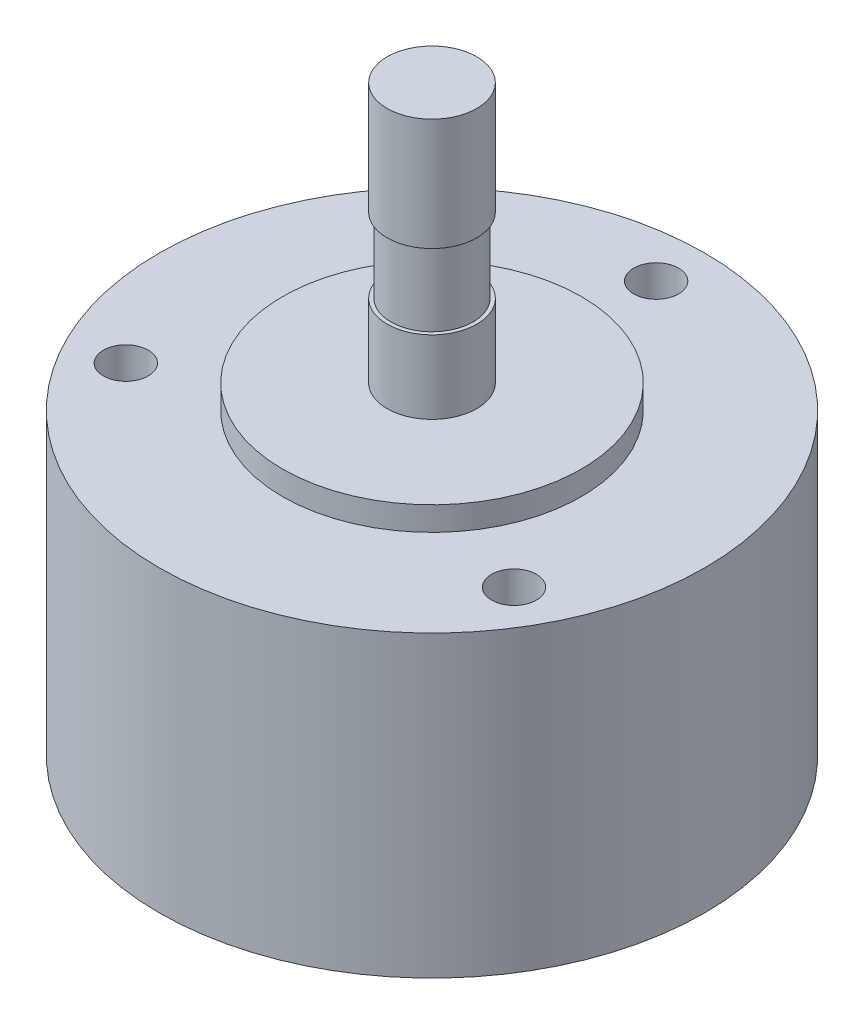
ISO-10303-21;
HEADER;
FILE_DESCRIPTION(('STEP AP214'),'2;1');
FILE_NAME('part.step','',(''),(''),'','','');
FILE_SCHEMA(('AUTOMOTIVE_DESIGN { 1 0 10303 214 1 1 1 1 }'));
ENDSEC;
DATA;
#1=APPLICATION_CONTEXT('core data for automotive mechanical design processes');
#2=APPLICATION_PROTOCOL_DEFINITION('international standard','automotive_design',2000,#1);
#3=PRODUCT_CONTEXT('',#1,'mechanical');
#4=PRODUCT('Part','Part','',(#3));
#5=PRODUCT_RELATED_PRODUCT_CATEGORY('part','',(#4));
#6=PRODUCT_DEFINITION_FORMATION('','',#4);
#7=PRODUCT_DEFINITION_CONTEXT('part definition',#1,'design');
#8=PRODUCT_DEFINITION('design','',#6,#7);
#9=PRODUCT_DEFINITION_SHAPE('','',#8);
#10=(LENGTH_UNIT() NAMED_UNIT(*) SI_UNIT(.MILLI.,.METRE.));
#11=(NAMED_UNIT(*) PLANE_ANGLE_UNIT() SI_UNIT($,.RADIAN.));
#12=(NAMED_UNIT(*) SI_UNIT($,.STERADIAN.) SOLID_ANGLE_UNIT());
#13=UNCERTAINTY_MEASURE_WITH_UNIT(LENGTH_MEASURE(1.E-05),#10,'distance_accuracy_value','');
#14=(GEOMETRIC_REPRESENTATION_CONTEXT(3) GLOBAL_UNCERTAINTY_ASSIGNED_CONTEXT((#13)) GLOBAL_UNIT_ASSIGNED_CONTEXT((#10,
#11,#12)) REPRESENTATION_CONTEXT('',''));
#15=CARTESIAN_POINT('',(0.,0.,0.));
#16=DIRECTION('',(0.,0.,1.));
#17=DIRECTION('',(1.,0.,0.));
#18=AXIS2_PLACEMENT_3D('',#15,#16,#17);
#19=CARTESIAN_POINT('',(0.,39.,0.));
#20=DIRECTION('',(0.,-1.,0.));
#21=DIRECTION('',(0.,0.,-1.));
#22=AXIS2_PLACEMENT_3D('',#19,#20,#21);
#23=CYLINDRICAL_SURFACE('',#22,3.);
#24=CARTESIAN_POINT('',(0.,21.6,0.));
#25=DIRECTION('',(0.,1.,0.));
#26=DIRECTION('',(0.,0.,1.));
#27=AXIS2_PLACEMENT_3D('',#24,#25,#26);
#28=CIRCLE('',#27,3.);
#29=CARTESIAN_POINT('',(0.,21.6,3.));
#30=VERTEX_POINT('',#29);
#31=EDGE_CURVE('E11',#30,#30,#28,.T.);
#32=ORIENTED_EDGE('',*,*,#31,.T.);
#33=EDGE_LOOP('',(#32));
#34=FACE_BOUND('',#33,.T.);
#35=CARTESIAN_POINT('',(0.,26.5,0.));
#36=DIRECTION('',(0.,1.,0.));
#37=DIRECTION('',(0.,0.,1.));
#38=AXIS2_PLACEMENT_3D('',#35,#36,#37);
#39=CIRCLE('',#38,3.);
#40=CARTESIAN_POINT('',(0.,26.5,3.));
#41=VERTEX_POINT('',#40);
#42=EDGE_CURVE('E109',#41,#41,#39,.T.);
#43=ORIENTED_EDGE('',*,*,#42,.F.);
#44=EDGE_LOOP('',(#43));
#45=FACE_BOUND('',#44,.T.);
#46=ADVANCED_FACE('F43',(#34,#45),#23,.T.);
#47=CARTESIAN_POINT('',(0.,20.,0.));
#48=DIRECTION('',(0.,-1.,0.));
#49=DIRECTION('',(0.,0.,-1.));
#50=AXIS2_PLACEMENT_3D('',#47,#48,#49);
#51=CYLINDRICAL_SURFACE('',#50,18.25);
#52=CARTESIAN_POINT('',(0.,20.,0.));
#53=DIRECTION('',(0.,1.,0.));
#54=DIRECTION('',(0.,0.,1.));
#55=AXIS2_PLACEMENT_3D('',#52,#53,#54);
#56=CIRCLE('',#55,18.25);
#57=CARTESIAN_POINT('',(0.,20.,18.25));
#58=VERTEX_POINT('',#57);
#59=EDGE_CURVE('E123',#58,#58,#56,.T.);
#60=ORIENTED_EDGE('',*,*,#59,.F.);
#61=EDGE_LOOP('',(#60));
#62=FACE_BOUND('',#61,.T.);
#63=CARTESIAN_POINT('',(0.,0.,0.));
#64=DIRECTION('',(0.,1.,0.));
#65=DIRECTION('',(0.,0.,1.));
#66=AXIS2_PLACEMENT_3D('',#63,#64,#65);
#67=CIRCLE('',#66,18.25);
#68=CARTESIAN_POINT('',(0.,0.,18.25));
#69=VERTEX_POINT('',#68);
#70=EDGE_CURVE('E47',#69,#69,#67,.T.);
#71=ORIENTED_EDGE('',*,*,#70,.T.);
#72=EDGE_LOOP('',(#71));
#73=FACE_BOUND('',#72,.T.);
#74=ADVANCED_FACE('F45',(#62,#73),#51,.T.);
#75=CARTESIAN_POINT('',(0.,20.,0.));
#76=DIRECTION('',(0.,1.,0.));
#77=DIRECTION('',(0.,0.,1.));
#78=AXIS2_PLACEMENT_3D('',#75,#76,#77);
#79=PLANE('',#78);
#80=CARTESIAN_POINT('',(12.9903810567666,20.,7.49999999999988));
#81=DIRECTION('',(0.,1.,0.));
#82=DIRECTION('',(0.,0.,1.));
#83=AXIS2_PLACEMENT_3D('',#80,#81,#82);
#84=CIRCLE('',#83,1.49999999999999);
#85=CARTESIAN_POINT('',(12.9903810567666,20.,8.99999999999987));
#86=VERTEX_POINT('',#85);
#87=EDGE_CURVE('E76',#86,#86,#84,.T.);
#88=ORIENTED_EDGE('',*,*,#87,.F.);
#89=EDGE_LOOP('',(#88));
#90=FACE_BOUND('',#89,.T.);
#91=CARTESIAN_POINT('',(-12.9903810567665,20.,7.50000000000006));
#92=DIRECTION('',(0.,1.,0.));
#93=DIRECTION('',(0.,0.,1.));
#94=AXIS2_PLACEMENT_3D('',#91,#92,#93);
#95=CIRCLE('',#94,1.49999999999999);
#96=CARTESIAN_POINT('',(-12.9903810567665,20.,9.00000000000005));
#97=VERTEX_POINT('',#96);
#98=EDGE_CURVE('E75',#97,#97,#95,.T.);
#99=ORIENTED_EDGE('',*,*,#98,.F.);
#100=EDGE_LOOP('',(#99));
#101=FACE_BOUND('',#100,.T.);
#102=CARTESIAN_POINT('',(0.,20.,-15.));
#103=DIRECTION('',(0.,1.,0.));
#104=DIRECTION('',(0.,0.,1.));
#105=AXIS2_PLACEMENT_3D('',#102,#103,#104);
#106=CIRCLE('',#105,1.49999999999999);
#107=CARTESIAN_POINT('',(0.,20.,-13.5));
#108=VERTEX_POINT('',#107);
#109=EDGE_CURVE('E89',#108,#108,#106,.T.);
#110=ORIENTED_EDGE('',*,*,#109,.F.);
#111=EDGE_LOOP('',(#110));
#112=FACE_BOUND('',#111,.T.);
#113=CARTESIAN_POINT('',(0.,20.,0.));
#114=DIRECTION('',(0.,1.,0.));
#115=DIRECTION('',(0.,0.,1.));
#116=AXIS2_PLACEMENT_3D('',#113,#114,#115);
#117=CIRCLE('',#116,10.);
#118=CARTESIAN_POINT('',(0.,20.,10.));
#119=VERTEX_POINT('',#118);
#120=EDGE_CURVE('E53',#119,#119,#117,.T.);
#121=ORIENTED_EDGE('',*,*,#120,.F.);
#122=EDGE_LOOP('',(#121));
#123=FACE_BOUND('',#122,.T.);
#124=ORIENTED_EDGE('',*,*,#59,.T.);
#125=EDGE_LOOP('',(#124));
#126=FACE_BOUND('',#125,.T.);
#127=ADVANCED_FACE('F136',(#90,#101,#112,#123,#126),#79,.T.);
#128=CARTESIAN_POINT('',(0.,0.,0.));
#129=DIRECTION('',(0.,1.,0.));
#130=DIRECTION('',(0.,0.,1.));
#131=AXIS2_PLACEMENT_3D('',#128,#129,#130);
#132=PLANE('',#131);
#133=ORIENTED_EDGE('',*,*,#70,.F.);
#134=EDGE_LOOP('',(#133));
#135=FACE_BOUND('',#134,.T.);
#136=ADVANCED_FACE('F133',(#135),#132,.F.);
#137=CARTESIAN_POINT('',(0.,21.6,0.));
#138=DIRECTION('',(0.,-1.,0.));
#139=DIRECTION('',(0.,0.,-1.));
#140=AXIS2_PLACEMENT_3D('',#137,#138,#139);
#141=CYLINDRICAL_SURFACE('',#140,10.);
#142=CARTESIAN_POINT('',(0.,21.6,0.));
#143=DIRECTION('',(0.,1.,0.));
#144=DIRECTION('',(0.,0.,1.));
#145=AXIS2_PLACEMENT_3D('',#142,#143,#144);
#146=CIRCLE('',#145,10.);
#147=CARTESIAN_POINT('',(0.,21.6,10.));
#148=VERTEX_POINT('',#147);
#149=EDGE_CURVE('E116',#148,#148,#146,.T.);
#150=ORIENTED_EDGE('',*,*,#149,.F.);
#151=EDGE_LOOP('',(#150));
#152=FACE_BOUND('',#151,.T.);
#153=ORIENTED_EDGE('',*,*,#120,.T.);
#154=EDGE_LOOP('',(#153));
#155=FACE_BOUND('',#154,.T.);
#156=ADVANCED_FACE('F135',(#152,#155),#141,.T.);
#157=CARTESIAN_POINT('',(0.,21.6,0.));
#158=DIRECTION('',(0.,1.,0.));
#159=DIRECTION('',(0.,0.,1.));
#160=AXIS2_PLACEMENT_3D('',#157,#158,#159);
#161=PLANE('',#160);
#162=ORIENTED_EDGE('',*,*,#31,.F.);
#163=EDGE_LOOP('',(#162));
#164=FACE_BOUND('',#163,.T.);
#165=ORIENTED_EDGE('',*,*,#149,.T.);
#166=EDGE_LOOP('',(#165));
#167=FACE_BOUND('',#166,.T.);
#168=ADVANCED_FACE('F141',(#164,#167),#161,.T.);
#169=CARTESIAN_POINT('',(0.,26.5,-3.));
#170=DIRECTION('',(0.,1.,0.));
#171=DIRECTION('',(0.,0.,1.));
#172=AXIS2_PLACEMENT_3D('',#169,#170,#171);
#173=PLANE('',#172);
#174=ORIENTED_EDGE('',*,*,#42,.T.);
#175=EDGE_LOOP('',(#174));
#176=FACE_BOUND('',#175,.T.);
#177=CARTESIAN_POINT('',(0.,26.5,0.));
#178=DIRECTION('',(0.,1.,0.));
#179=DIRECTION('',(0.,0.,1.));
#180=AXIS2_PLACEMENT_3D('',#177,#178,#179);
#181=CIRCLE('',#180,2.75);
#182=CARTESIAN_POINT('',(0.,26.5,2.75));
#183=VERTEX_POINT('',#182);
#184=EDGE_CURVE('E105',#183,#183,#181,.T.);
#185=ORIENTED_EDGE('',*,*,#184,.F.);
#186=EDGE_LOOP('',(#185));
#187=FACE_BOUND('',#186,.T.);
#188=ADVANCED_FACE('F180',(#176,#187),#173,.T.);
#189=CARTESIAN_POINT('',(0.,39.,0.));
#190=DIRECTION('',(0.,1.,0.));
#191=DIRECTION('',(0.,0.,1.));
#192=AXIS2_PLACEMENT_3D('',#189,#190,#191);
#193=CYLINDRICAL_SURFACE('',#192,2.75);
#194=ORIENTED_EDGE('',*,*,#184,.T.);
#195=EDGE_LOOP('',(#194));
#196=FACE_BOUND('',#195,.T.);
#197=CARTESIAN_POINT('',(0.,31.5,0.));
#198=DIRECTION('',(0.,1.,0.));
#199=DIRECTION('',(0.,0.,1.));
#200=AXIS2_PLACEMENT_3D('',#197,#198,#199);
#201=CIRCLE('',#200,2.75);
#202=CARTESIAN_POINT('',(0.,31.5,2.75));
#203=VERTEX_POINT('',#202);
#204=EDGE_CURVE('E101',#203,#203,#201,.T.);
#205=ORIENTED_EDGE('',*,*,#204,.F.);
#206=EDGE_LOOP('',(#205));
#207=FACE_BOUND('',#206,.T.);
#208=ADVANCED_FACE('F174',(#196,#207),#193,.T.);
#209=CARTESIAN_POINT('',(0.,31.5,-3.));
#210=DIRECTION('',(0.,-1.,0.));
#211=DIRECTION('',(0.,0.,-1.));
#212=AXIS2_PLACEMENT_3D('',#209,#210,#211);
#213=PLANE('',#212);
#214=ORIENTED_EDGE('',*,*,#204,.T.);
#215=EDGE_LOOP('',(#214));
#216=FACE_BOUND('',#215,.T.);
#217=CARTESIAN_POINT('',(0.,31.5,0.));
#218=DIRECTION('',(0.,1.,0.));
#219=DIRECTION('',(0.,0.,1.));
#220=AXIS2_PLACEMENT_3D('',#217,#218,#219);
#221=CIRCLE('',#220,3.);
#222=CARTESIAN_POINT('',(0.,31.5,3.));
#223=VERTEX_POINT('',#222);
#224=EDGE_CURVE('E97',#223,#223,#221,.T.);
#225=ORIENTED_EDGE('',*,*,#224,.F.);
#226=EDGE_LOOP('',(#225));
#227=FACE_BOUND('',#226,.T.);
#228=ADVANCED_FACE('F167',(#216,#227),#213,.T.);
#229=CARTESIAN_POINT('',(0.,39.,0.));
#230=DIRECTION('',(0.,1.,0.));
#231=DIRECTION('',(0.,0.,1.));
#232=AXIS2_PLACEMENT_3D('',#229,#230,#231);
#233=PLANE('',#232);
#234=CARTESIAN_POINT('',(0.,39.,0.));
#235=DIRECTION('',(0.,1.,0.));
#236=DIRECTION('',(0.,0.,1.));
#237=AXIS2_PLACEMENT_3D('',#234,#235,#236);
#238=CIRCLE('',#237,3.);
#239=CARTESIAN_POINT('',(0.,39.,3.));
#240=VERTEX_POINT('',#239);
#241=EDGE_CURVE('E113',#240,#240,#238,.T.);
#242=ORIENTED_EDGE('',*,*,#241,.T.);
#243=EDGE_LOOP('',(#242));
#244=FACE_BOUND('',#243,.T.);
#245=ADVANCED_FACE('F159',(#244),#233,.T.);
#246=ORIENTED_EDGE('',*,*,#241,.F.);
#247=EDGE_LOOP('',(#246));
#248=FACE_BOUND('',#247,.T.);
#249=ORIENTED_EDGE('',*,*,#224,.T.);
#250=EDGE_LOOP('',(#249));
#251=FACE_BOUND('',#250,.T.);
#252=ADVANCED_FACE('F149',(#248,#251),#23,.T.);
#253=CARTESIAN_POINT('',(0.,14.,-15.));
#254=DIRECTION('',(0.,1.,0.));
#255=DIRECTION('',(0.,0.,1.));
#256=AXIS2_PLACEMENT_3D('',#253,#254,#255);
#257=CONICAL_SURFACE('',#256,1.5,1.02974425867665);
#258=CARTESIAN_POINT('',(0.,13.0987090714587,-15.));
#259=VERTEX_POINT('',#258);
#260=VERTEX_LOOP('',#259);
#261=FACE_BOUND('',#260,.T.);
#262=CARTESIAN_POINT('',(0.,14.,-15.));
#263=DIRECTION('',(0.,1.,0.));
#264=DIRECTION('',(0.,0.,1.));
#265=AXIS2_PLACEMENT_3D('',#262,#263,#264);
#266=CIRCLE('',#265,1.5);
#267=CARTESIAN_POINT('',(0.,14.,-13.5));
#268=VERTEX_POINT('',#267);
#269=EDGE_CURVE('E93',#268,#268,#266,.T.);
#270=ORIENTED_EDGE('',*,*,#269,.T.);
#271=EDGE_LOOP('',(#270));
#272=FACE_BOUND('',#271,.T.);
#273=ADVANCED_FACE('F158',(#261,#272),#257,.F.);
#274=CARTESIAN_POINT('',(0.,20.,-15.));
#275=DIRECTION('',(0.,1.,0.));
#276=DIRECTION('',(0.,0.,1.));
#277=AXIS2_PLACEMENT_3D('',#274,#275,#276);
#278=CYLINDRICAL_SURFACE('',#277,1.49999999999999);
#279=ORIENTED_EDGE('',*,*,#269,.F.);
#280=EDGE_LOOP('',(#279));
#281=FACE_BOUND('',#280,.T.);
#282=ORIENTED_EDGE('',*,*,#109,.T.);
#283=EDGE_LOOP('',(#282));
#284=FACE_BOUND('',#283,.T.);
#285=ADVANCED_FACE('F165',(#281,#284),#278,.F.);
#286=CARTESIAN_POINT('',(-12.9903810567665,14.,7.50000000000006));
#287=DIRECTION('',(0.,1.,0.));
#288=DIRECTION('',(0.,0.,1.));
#289=AXIS2_PLACEMENT_3D('',#286,#287,#288);
#290=CONICAL_SURFACE('',#289,1.5,1.02974425867665);
#291=CARTESIAN_POINT('',(-12.9903810567665,13.0987090714587,7.50000000000006));
#292=VERTEX_POINT('',#291);
#293=VERTEX_LOOP('',#292);
#294=FACE_BOUND('',#293,.T.);
#295=CARTESIAN_POINT('',(-12.9903810567665,14.,7.50000000000006));
#296=DIRECTION('',(0.,1.,0.));
#297=DIRECTION('',(0.,0.,1.));
#298=AXIS2_PLACEMENT_3D('',#295,#296,#297);
#299=CIRCLE('',#298,1.5);
#300=CARTESIAN_POINT('',(-12.9903810567665,14.,9.00000000000006));
#301=VERTEX_POINT('',#300);
#302=EDGE_CURVE('E81',#301,#301,#299,.T.);
#303=ORIENTED_EDGE('',*,*,#302,.T.);
#304=EDGE_LOOP('',(#303));
#305=FACE_BOUND('',#304,.T.);
#306=ADVANCED_FACE('F235',(#294,#305),#290,.F.);
#307=CARTESIAN_POINT('',(-12.9903810567665,20.,7.50000000000006));
#308=DIRECTION('',(0.,1.,0.));
#309=DIRECTION('',(0.,0.,1.));
#310=AXIS2_PLACEMENT_3D('',#307,#308,#309);
#311=CYLINDRICAL_SURFACE('',#310,1.49999999999999);
#312=ORIENTED_EDGE('',*,*,#302,.F.);
#313=EDGE_LOOP('',(#312));
#314=FACE_BOUND('',#313,.T.);
#315=ORIENTED_EDGE('',*,*,#98,.T.);
#316=EDGE_LOOP('',(#315));
#317=FACE_BOUND('',#316,.T.);
#318=ADVANCED_FACE('F68',(#314,#317),#311,.F.);
#319=CARTESIAN_POINT('',(12.9903810567666,14.,7.49999999999988));
#320=DIRECTION('',(0.,1.,0.));
#321=DIRECTION('',(0.,0.,1.));
#322=AXIS2_PLACEMENT_3D('',#319,#320,#321);
#323=CONICAL_SURFACE('',#322,1.5,1.02974425867665);
#324=CARTESIAN_POINT('',(12.9903810567666,13.0987090714587,7.49999999999988));
#325=VERTEX_POINT('',#324);
#326=VERTEX_LOOP('',#325);
#327=FACE_BOUND('',#326,.T.);
#328=CARTESIAN_POINT('',(12.9903810567666,14.,7.49999999999988));
#329=DIRECTION('',(0.,1.,0.));
#330=DIRECTION('',(0.,0.,1.));
#331=AXIS2_PLACEMENT_3D('',#328,#329,#330);
#332=CIRCLE('',#331,1.5);
#333=CARTESIAN_POINT('',(12.9903810567666,14.,8.99999999999988));
#334=VERTEX_POINT('',#333);
#335=EDGE_CURVE('E72',#334,#334,#332,.T.);
#336=ORIENTED_EDGE('',*,*,#335,.T.);
#337=EDGE_LOOP('',(#336));
#338=FACE_BOUND('',#337,.T.);
#339=ADVANCED_FACE('F64',(#327,#338),#323,.F.);
#340=CARTESIAN_POINT('',(12.9903810567666,20.,7.49999999999988));
#341=DIRECTION('',(0.,1.,0.));
#342=DIRECTION('',(0.,0.,1.));
#343=AXIS2_PLACEMENT_3D('',#340,#341,#342);
#344=CYLINDRICAL_SURFACE('',#343,1.49999999999999);
#345=ORIENTED_EDGE('',*,*,#335,.F.);
#346=EDGE_LOOP('',(#345));
#347=FACE_BOUND('',#346,.T.);
#348=ORIENTED_EDGE('',*,*,#87,.T.);
#349=EDGE_LOOP('',(#348));
#350=FACE_BOUND('',#349,.T.);
#351=ADVANCED_FACE('F67',(#347,#350),#344,.F.);
#352=CLOSED_SHELL('',(#46,#74,#127,#136,#156,#168,#188,#208,#228,#245,#252,#273,#285,#306,#318,
#339,#351));
#353=MANIFOLD_SOLID_BREP('B2',#352);
#354=ADVANCED_BREP_SHAPE_REPRESENTATION('',(#18,#353),#14);
#355=SHAPE_DEFINITION_REPRESENTATION(#9,#354);
ENDSEC;
END-ISO-10303-21;
